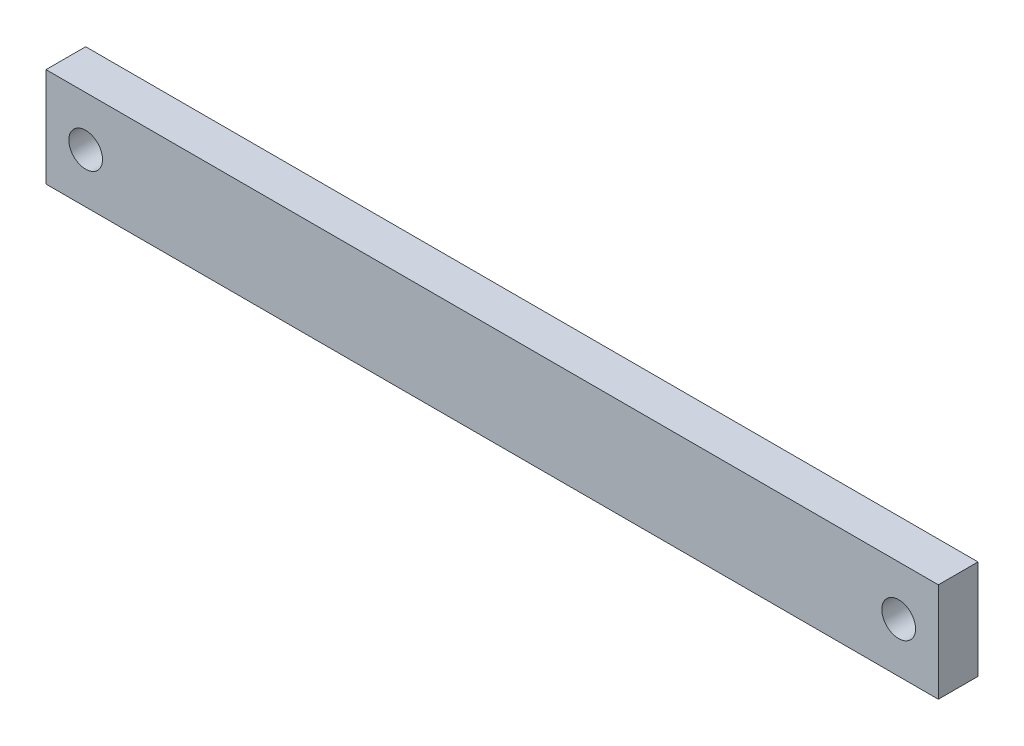
ISO-10303-21;
HEADER;
FILE_DESCRIPTION(('STEP AP214'),'2;1');
FILE_NAME('part.step','',(''),(''),'','','');
FILE_SCHEMA(('AUTOMOTIVE_DESIGN { 1 0 10303 214 1 1 1 1 }'));
ENDSEC;
DATA;
#1=APPLICATION_CONTEXT('core data for automotive mechanical design processes');
#2=APPLICATION_PROTOCOL_DEFINITION('international standard','automotive_design',2000,#1);
#3=PRODUCT_CONTEXT('',#1,'mechanical');
#4=PRODUCT('Part','Part','',(#3));
#5=PRODUCT_RELATED_PRODUCT_CATEGORY('part','',(#4));
#6=PRODUCT_DEFINITION_FORMATION('','',#4);
#7=PRODUCT_DEFINITION_CONTEXT('part definition',#1,'design');
#8=PRODUCT_DEFINITION('design','',#6,#7);
#9=PRODUCT_DEFINITION_SHAPE('','',#8);
#10=(LENGTH_UNIT() NAMED_UNIT(*) SI_UNIT(.MILLI.,.METRE.));
#11=(NAMED_UNIT(*) PLANE_ANGLE_UNIT() SI_UNIT($,.RADIAN.));
#12=(NAMED_UNIT(*) SI_UNIT($,.STERADIAN.) SOLID_ANGLE_UNIT());
#13=UNCERTAINTY_MEASURE_WITH_UNIT(LENGTH_MEASURE(1.E-05),#10,'distance_accuracy_value','');
#14=(GEOMETRIC_REPRESENTATION_CONTEXT(3) GLOBAL_UNCERTAINTY_ASSIGNED_CONTEXT((#13)) GLOBAL_UNIT_ASSIGNED_CONTEXT((#10,
#11,#12)) REPRESENTATION_CONTEXT('',''));
#15=CARTESIAN_POINT('',(0.,0.,0.));
#16=DIRECTION('',(0.,0.,1.));
#17=DIRECTION('',(1.,0.,0.));
#18=AXIS2_PLACEMENT_3D('',#15,#16,#17);
#19=CARTESIAN_POINT('',(-39.,-5.,47.));
#20=DIRECTION('',(1.,0.,0.));
#21=DIRECTION('',(0.,0.,-1.));
#22=AXIS2_PLACEMENT_3D('',#19,#20,#21);
#23=PLANE('',#22);
#24=DIRECTION('',(0.,-1.,0.));
#25=VECTOR('',#24,1.);
#26=CARTESIAN_POINT('',(-39.,-5.,43.));
#27=LINE('',#26,#25);
#28=CARTESIAN_POINT('',(-39.,5.,43.));
#29=VERTEX_POINT('',#28);
#30=CARTESIAN_POINT('',(-39.,-5.,43.));
#31=VERTEX_POINT('',#30);
#32=EDGE_CURVE('E107',#29,#31,#27,.T.);
#33=ORIENTED_EDGE('',*,*,#32,.T.);
#34=DIRECTION('',(0.,0.,-1.));
#35=VECTOR('',#34,1.);
#36=CARTESIAN_POINT('',(-39.,-5.,47.));
#37=LINE('',#36,#35);
#38=CARTESIAN_POINT('',(-39.,-5.,47.));
#39=VERTEX_POINT('',#38);
#40=EDGE_CURVE('E11',#39,#31,#37,.T.);
#41=ORIENTED_EDGE('',*,*,#40,.F.);
#42=DIRECTION('',(0.,-1.,0.));
#43=VECTOR('',#42,1.);
#44=CARTESIAN_POINT('',(-39.,-5.,47.));
#45=LINE('',#44,#43);
#46=CARTESIAN_POINT('',(-39.,5.,47.));
#47=VERTEX_POINT('',#46);
#48=EDGE_CURVE('E94',#47,#39,#45,.T.);
#49=ORIENTED_EDGE('',*,*,#48,.F.);
#50=DIRECTION('',(0.,0.,-1.));
#51=VECTOR('',#50,1.);
#52=CARTESIAN_POINT('',(-39.,5.,47.));
#53=LINE('',#52,#51);
#54=EDGE_CURVE('E103',#47,#29,#53,.T.);
#55=ORIENTED_EDGE('',*,*,#54,.T.);
#56=EDGE_LOOP('',(#33,#41,#49,#55));
#57=FACE_BOUND('',#56,.T.);
#58=ADVANCED_FACE('F41',(#57),#23,.F.);
#59=CARTESIAN_POINT('',(-39.,-5.,47.));
#60=DIRECTION('',(0.,1.,0.));
#61=DIRECTION('',(0.,0.,1.));
#62=AXIS2_PLACEMENT_3D('',#59,#60,#61);
#63=PLANE('',#62);
#64=DIRECTION('',(1.,0.,0.));
#65=VECTOR('',#64,1.);
#66=CARTESIAN_POINT('',(-39.,-5.,43.));
#67=LINE('',#66,#65);
#68=CARTESIAN_POINT('',(51.,-5.,43.));
#69=VERTEX_POINT('',#68);
#70=EDGE_CURVE('E98',#31,#69,#67,.T.);
#71=ORIENTED_EDGE('',*,*,#70,.T.);
#72=DIRECTION('',(0.,0.,-1.));
#73=VECTOR('',#72,1.);
#74=CARTESIAN_POINT('',(51.,-5.,47.));
#75=LINE('',#74,#73);
#76=CARTESIAN_POINT('',(51.,-5.,47.));
#77=VERTEX_POINT('',#76);
#78=EDGE_CURVE('E50',#77,#69,#75,.T.);
#79=ORIENTED_EDGE('',*,*,#78,.F.);
#80=DIRECTION('',(1.,0.,0.));
#81=VECTOR('',#80,1.);
#82=CARTESIAN_POINT('',(-39.,-5.,47.));
#83=LINE('',#82,#81);
#84=EDGE_CURVE('E89',#39,#77,#83,.T.);
#85=ORIENTED_EDGE('',*,*,#84,.F.);
#86=ORIENTED_EDGE('',*,*,#40,.T.);
#87=EDGE_LOOP('',(#71,#79,#85,#86));
#88=FACE_BOUND('',#87,.T.);
#89=ADVANCED_FACE('F97',(#88),#63,.F.);
#90=CARTESIAN_POINT('',(51.,-5.,47.));
#91=DIRECTION('',(-1.,0.,0.));
#92=DIRECTION('',(0.,0.,1.));
#93=AXIS2_PLACEMENT_3D('',#90,#91,#92);
#94=PLANE('',#93);
#95=DIRECTION('',(0.,1.,0.));
#96=VECTOR('',#95,1.);
#97=CARTESIAN_POINT('',(51.,-5.,43.));
#98=LINE('',#97,#96);
#99=CARTESIAN_POINT('',(51.,5.,43.));
#100=VERTEX_POINT('',#99);
#101=EDGE_CURVE('E76',#69,#100,#98,.T.);
#102=ORIENTED_EDGE('',*,*,#101,.T.);
#103=DIRECTION('',(0.,0.,-1.));
#104=VECTOR('',#103,1.);
#105=CARTESIAN_POINT('',(51.,5.,47.));
#106=LINE('',#105,#104);
#107=CARTESIAN_POINT('',(51.,5.,47.));
#108=VERTEX_POINT('',#107);
#109=EDGE_CURVE('E99',#108,#100,#106,.T.);
#110=ORIENTED_EDGE('',*,*,#109,.F.);
#111=DIRECTION('',(0.,1.,0.));
#112=VECTOR('',#111,1.);
#113=CARTESIAN_POINT('',(51.,-5.,47.));
#114=LINE('',#113,#112);
#115=EDGE_CURVE('E92',#77,#108,#114,.T.);
#116=ORIENTED_EDGE('',*,*,#115,.F.);
#117=ORIENTED_EDGE('',*,*,#78,.T.);
#118=EDGE_LOOP('',(#102,#110,#116,#117));
#119=FACE_BOUND('',#118,.T.);
#120=ADVANCED_FACE('F101',(#119),#94,.F.);
#121=CARTESIAN_POINT('',(-39.,5.,47.));
#122=DIRECTION('',(0.,-1.,0.));
#123=DIRECTION('',(0.,0.,-1.));
#124=AXIS2_PLACEMENT_3D('',#121,#122,#123);
#125=PLANE('',#124);
#126=DIRECTION('',(-1.,0.,0.));
#127=VECTOR('',#126,1.);
#128=CARTESIAN_POINT('',(-39.,5.,43.));
#129=LINE('',#128,#127);
#130=EDGE_CURVE('E82',#100,#29,#129,.T.);
#131=ORIENTED_EDGE('',*,*,#130,.T.);
#132=ORIENTED_EDGE('',*,*,#54,.F.);
#133=DIRECTION('',(-1.,0.,0.));
#134=VECTOR('',#133,1.);
#135=CARTESIAN_POINT('',(-39.,5.,47.));
#136=LINE('',#135,#134);
#137=EDGE_CURVE('E59',#108,#47,#136,.T.);
#138=ORIENTED_EDGE('',*,*,#137,.F.);
#139=ORIENTED_EDGE('',*,*,#109,.T.);
#140=EDGE_LOOP('',(#131,#132,#138,#139));
#141=FACE_BOUND('',#140,.T.);
#142=ADVANCED_FACE('F153',(#141),#125,.F.);
#143=CARTESIAN_POINT('',(0.,0.,47.));
#144=DIRECTION('',(0.,0.,-1.));
#145=DIRECTION('',(-1.,0.,0.));
#146=AXIS2_PLACEMENT_3D('',#143,#144,#145);
#147=PLANE('',#146);
#148=CARTESIAN_POINT('',(-35.,0.,47.));
#149=DIRECTION('',(0.,0.,-1.));
#150=DIRECTION('',(-1.,0.,0.));
#151=AXIS2_PLACEMENT_3D('',#148,#149,#150);
#152=CIRCLE('',#151,1.7);
#153=CARTESIAN_POINT('',(-36.7,0.,47.));
#154=VERTEX_POINT('',#153);
#155=EDGE_CURVE('E110',#154,#154,#152,.T.);
#156=ORIENTED_EDGE('',*,*,#155,.T.);
#157=EDGE_LOOP('',(#156));
#158=FACE_BOUND('',#157,.T.);
#159=CARTESIAN_POINT('',(47.,0.,47.));
#160=DIRECTION('',(0.,0.,-1.));
#161=DIRECTION('',(-1.,0.,0.));
#162=AXIS2_PLACEMENT_3D('',#159,#160,#161);
#163=CIRCLE('',#162,1.7);
#164=CARTESIAN_POINT('',(45.3,0.,47.));
#165=VERTEX_POINT('',#164);
#166=EDGE_CURVE('E117',#165,#165,#163,.T.);
#167=ORIENTED_EDGE('',*,*,#166,.T.);
#168=EDGE_LOOP('',(#167));
#169=FACE_BOUND('',#168,.T.);
#170=ORIENTED_EDGE('',*,*,#48,.T.);
#171=ORIENTED_EDGE('',*,*,#84,.T.);
#172=ORIENTED_EDGE('',*,*,#115,.T.);
#173=ORIENTED_EDGE('',*,*,#137,.T.);
#174=EDGE_LOOP('',(#170,#171,#172,#173));
#175=FACE_BOUND('',#174,.T.);
#176=ADVANCED_FACE('F90',(#158,#169,#175),#147,.F.);
#177=CARTESIAN_POINT('',(0.,0.,43.));
#178=DIRECTION('',(0.,0.,-1.));
#179=DIRECTION('',(-1.,0.,0.));
#180=AXIS2_PLACEMENT_3D('',#177,#178,#179);
#181=PLANE('',#180);
#182=CARTESIAN_POINT('',(-35.,0.,43.));
#183=DIRECTION('',(0.,0.,-1.));
#184=DIRECTION('',(-1.,0.,0.));
#185=AXIS2_PLACEMENT_3D('',#182,#183,#184);
#186=CIRCLE('',#185,1.7);
#187=CARTESIAN_POINT('',(-36.7,0.,43.));
#188=VERTEX_POINT('',#187);
#189=EDGE_CURVE('E44',#188,#188,#186,.T.);
#190=ORIENTED_EDGE('',*,*,#189,.F.);
#191=EDGE_LOOP('',(#190));
#192=FACE_BOUND('',#191,.T.);
#193=CARTESIAN_POINT('',(47.,0.,43.));
#194=DIRECTION('',(0.,0.,-1.));
#195=DIRECTION('',(-1.,0.,0.));
#196=AXIS2_PLACEMENT_3D('',#193,#194,#195);
#197=CIRCLE('',#196,1.7);
#198=CARTESIAN_POINT('',(45.3,0.,43.));
#199=VERTEX_POINT('',#198);
#200=EDGE_CURVE('E115',#199,#199,#197,.T.);
#201=ORIENTED_EDGE('',*,*,#200,.F.);
#202=EDGE_LOOP('',(#201));
#203=FACE_BOUND('',#202,.T.);
#204=ORIENTED_EDGE('',*,*,#32,.F.);
#205=ORIENTED_EDGE('',*,*,#130,.F.);
#206=ORIENTED_EDGE('',*,*,#101,.F.);
#207=ORIENTED_EDGE('',*,*,#70,.F.);
#208=EDGE_LOOP('',(#204,#205,#206,#207));
#209=FACE_BOUND('',#208,.T.);
#210=ADVANCED_FACE('F138',(#192,#203,#209),#181,.T.);
#211=CARTESIAN_POINT('',(47.,0.,42.));
#212=DIRECTION('',(0.,0.,1.));
#213=DIRECTION('',(1.,0.,0.));
#214=AXIS2_PLACEMENT_3D('',#211,#212,#213);
#215=CYLINDRICAL_SURFACE('',#214,1.7);
#216=ORIENTED_EDGE('',*,*,#200,.T.);
#217=EDGE_LOOP('',(#216));
#218=FACE_BOUND('',#217,.T.);
#219=ORIENTED_EDGE('',*,*,#166,.F.);
#220=EDGE_LOOP('',(#219));
#221=FACE_BOUND('',#220,.T.);
#222=ADVANCED_FACE('F132',(#218,#221),#215,.F.);
#223=CARTESIAN_POINT('',(-35.,0.,42.));
#224=DIRECTION('',(0.,0.,1.));
#225=DIRECTION('',(1.,0.,0.));
#226=AXIS2_PLACEMENT_3D('',#223,#224,#225);
#227=CYLINDRICAL_SURFACE('',#226,1.7);
#228=ORIENTED_EDGE('',*,*,#189,.T.);
#229=EDGE_LOOP('',(#228));
#230=FACE_BOUND('',#229,.T.);
#231=ORIENTED_EDGE('',*,*,#155,.F.);
#232=EDGE_LOOP('',(#231));
#233=FACE_BOUND('',#232,.T.);
#234=ADVANCED_FACE('F130',(#230,#233),#227,.F.);
#235=CLOSED_SHELL('',(#58,#89,#120,#142,#176,#210,#222,#234));
#236=MANIFOLD_SOLID_BREP('B2',#235);
#237=ADVANCED_BREP_SHAPE_REPRESENTATION('',(#18,#236),#14);
#238=SHAPE_DEFINITION_REPRESENTATION(#9,#237);
ENDSEC;
END-ISO-10303-21;
